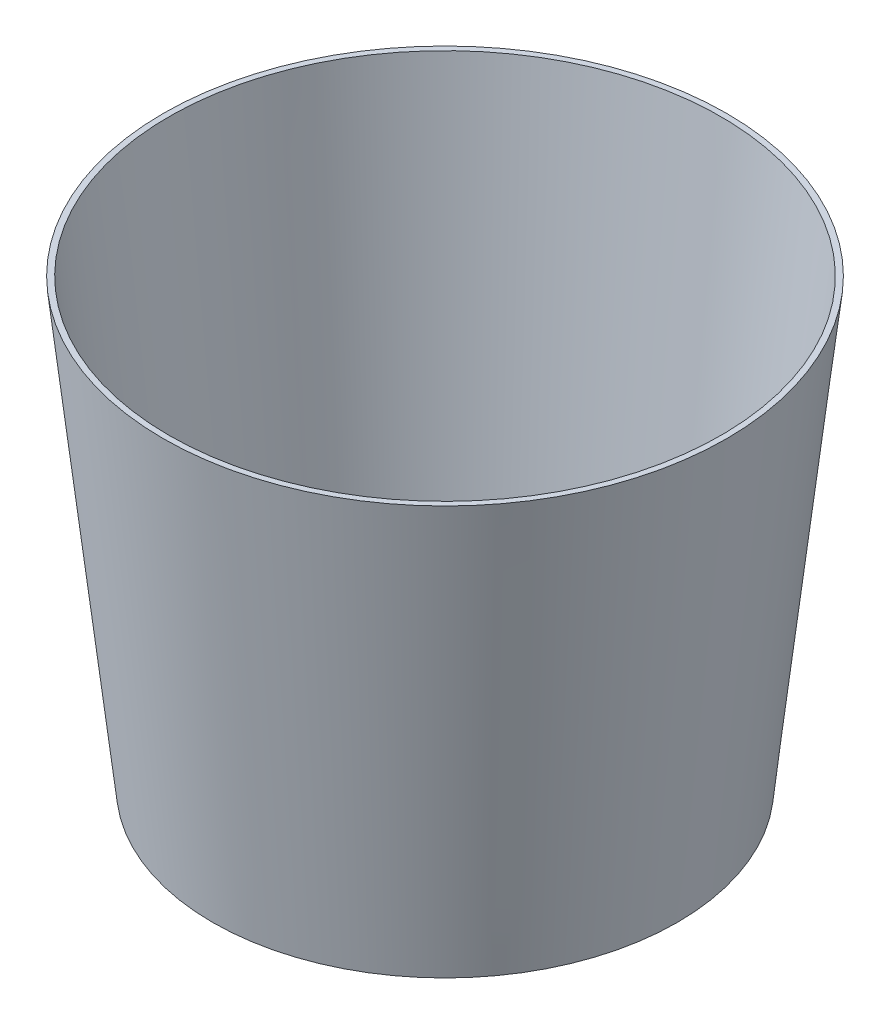
ISO-10303-21;
HEADER;
FILE_DESCRIPTION(('STEP AP214'),'2;1');
FILE_NAME('part.step','',(''),(''),'','','');
FILE_SCHEMA(('AUTOMOTIVE_DESIGN { 1 0 10303 214 1 1 1 1 }'));
ENDSEC;
DATA;
#1=APPLICATION_CONTEXT('core data for automotive mechanical design processes');
#2=APPLICATION_PROTOCOL_DEFINITION('international standard','automotive_design',2000,#1);
#3=PRODUCT_CONTEXT('',#1,'mechanical');
#4=PRODUCT('Part','Part','',(#3));
#5=PRODUCT_RELATED_PRODUCT_CATEGORY('part','',(#4));
#6=PRODUCT_DEFINITION_FORMATION('','',#4);
#7=PRODUCT_DEFINITION_CONTEXT('part definition',#1,'design');
#8=PRODUCT_DEFINITION('design','',#6,#7);
#9=PRODUCT_DEFINITION_SHAPE('','',#8);
#10=(LENGTH_UNIT() NAMED_UNIT(*) SI_UNIT(.MILLI.,.METRE.));
#11=(NAMED_UNIT(*) PLANE_ANGLE_UNIT() SI_UNIT($,.RADIAN.));
#12=(NAMED_UNIT(*) SI_UNIT($,.STERADIAN.) SOLID_ANGLE_UNIT());
#13=UNCERTAINTY_MEASURE_WITH_UNIT(LENGTH_MEASURE(1.E-05),#10,'distance_accuracy_value','');
#14=(GEOMETRIC_REPRESENTATION_CONTEXT(3) GLOBAL_UNCERTAINTY_ASSIGNED_CONTEXT((#13)) GLOBAL_UNIT_ASSIGNED_CONTEXT((#10,
#11,#12)) REPRESENTATION_CONTEXT('',''));
#15=CARTESIAN_POINT('',(0.,0.,0.));
#16=DIRECTION('',(0.,0.,1.));
#17=DIRECTION('',(1.,0.,0.));
#18=AXIS2_PLACEMENT_3D('',#15,#16,#17);
#19=CARTESIAN_POINT('',(0.,27.5879396984926,0.));
#20=DIRECTION('',(0.,1.,0.));
#21=DIRECTION('',(0.,0.,1.));
#22=AXIS2_PLACEMENT_3D('',#19,#20,#21);
#23=CONICAL_SURFACE('',#22,28.577185416502,0.110657221173892);
#24=CARTESIAN_POINT('',(0.,-17.4120603015075,-1.64026415808972E-13));
#25=DIRECTION('',(0.,1.,0.));
#26=DIRECTION('',(0.,0.,1.));
#27=AXIS2_PLACEMENT_3D('',#24,#25,#26);
#28=CIRCLE('',#27,23.5771854165021);
#29=CARTESIAN_POINT('',(0.,-17.4120603015075,23.5771854165019));
#30=VERTEX_POINT('',#29);
#31=EDGE_CURVE('E47',#30,#30,#28,.T.);
#32=ORIENTED_EDGE('',*,*,#31,.T.);
#33=EDGE_LOOP('',(#32));
#34=FACE_BOUND('',#33,.T.);
#35=CARTESIAN_POINT('',(0.,27.5879396984926,0.));
#36=DIRECTION('',(0.,1.,0.));
#37=DIRECTION('',(0.,0.,1.));
#38=AXIS2_PLACEMENT_3D('',#35,#36,#37);
#39=CIRCLE('',#38,28.577185416502);
#40=CARTESIAN_POINT('',(0.,27.5879396984925,28.5771854165019));
#41=VERTEX_POINT('',#40);
#42=EDGE_CURVE('E10',#41,#41,#39,.T.);
#43=ORIENTED_EDGE('',*,*,#42,.F.);
#44=EDGE_LOOP('',(#43));
#45=FACE_BOUND('',#44,.T.);
#46=ADVANCED_FACE('F33',(#34,#45),#23,.T.);
#47=CARTESIAN_POINT('',(0.,27.5879396984925,28.5771854165019));
#48=DIRECTION('',(0.,1.,0.));
#49=DIRECTION('',(0.,0.,1.));
#50=AXIS2_PLACEMENT_3D('',#47,#48,#49);
#51=PLANE('',#50);
#52=ORIENTED_EDGE('',*,*,#42,.T.);
#53=EDGE_LOOP('',(#52));
#54=FACE_BOUND('',#53,.T.);
#55=CARTESIAN_POINT('',(0.,27.5879396984926,0.));
#56=DIRECTION('',(0.,1.,0.));
#57=DIRECTION('',(0.,0.,1.));
#58=AXIS2_PLACEMENT_3D('',#55,#56,#57);
#59=CIRCLE('',#58,28.);
#60=CARTESIAN_POINT('',(0.,27.5879396984925,28.));
#61=VERTEX_POINT('',#60);
#62=EDGE_CURVE('E39',#61,#61,#59,.T.);
#63=ORIENTED_EDGE('',*,*,#62,.F.);
#64=EDGE_LOOP('',(#63));
#65=FACE_BOUND('',#64,.T.);
#66=ADVANCED_FACE('F63',(#54,#65),#51,.T.);
#67=CARTESIAN_POINT('',(0.,-17.4120603015075,-1.64026415808973E-13));
#68=DIRECTION('',(0.,1.,0.));
#69=DIRECTION('',(0.,0.,1.));
#70=AXIS2_PLACEMENT_3D('',#67,#68,#69);
#71=CONICAL_SURFACE('',#70,23.0000000000002,0.110657221173892);
#72=ORIENTED_EDGE('',*,*,#62,.T.);
#73=EDGE_LOOP('',(#72));
#74=FACE_BOUND('',#73,.T.);
#75=CARTESIAN_POINT('',(0.,-17.4120603015075,-1.64026415808973E-13));
#76=DIRECTION('',(0.,1.,0.));
#77=DIRECTION('',(0.,0.,1.));
#78=AXIS2_PLACEMENT_3D('',#75,#76,#77);
#79=CIRCLE('',#78,23.0000000000002);
#80=CARTESIAN_POINT('',(0.,-17.4120603015075,23.));
#81=VERTEX_POINT('',#80);
#82=EDGE_CURVE('E43',#81,#81,#79,.T.);
#83=ORIENTED_EDGE('',*,*,#82,.F.);
#84=EDGE_LOOP('',(#83));
#85=FACE_BOUND('',#84,.T.);
#86=ADVANCED_FACE('F57',(#74,#85),#71,.F.);
#87=CARTESIAN_POINT('',(0.,-17.4120603015075,23.5771854165019));
#88=DIRECTION('',(0.,-1.,0.));
#89=DIRECTION('',(0.,0.,-1.));
#90=AXIS2_PLACEMENT_3D('',#87,#88,#89);
#91=PLANE('',#90);
#92=ORIENTED_EDGE('',*,*,#82,.T.);
#93=EDGE_LOOP('',(#92));
#94=FACE_BOUND('',#93,.T.);
#95=ORIENTED_EDGE('',*,*,#31,.F.);
#96=EDGE_LOOP('',(#95));
#97=FACE_BOUND('',#96,.T.);
#98=ADVANCED_FACE('F55',(#94,#97),#91,.T.);
#99=CLOSED_SHELL('',(#46,#66,#86,#98));
#100=MANIFOLD_SOLID_BREP('B2',#99);
#101=ADVANCED_BREP_SHAPE_REPRESENTATION('',(#18,#100),#14);
#102=SHAPE_DEFINITION_REPRESENTATION(#9,#101);
ENDSEC;
END-ISO-10303-21;
